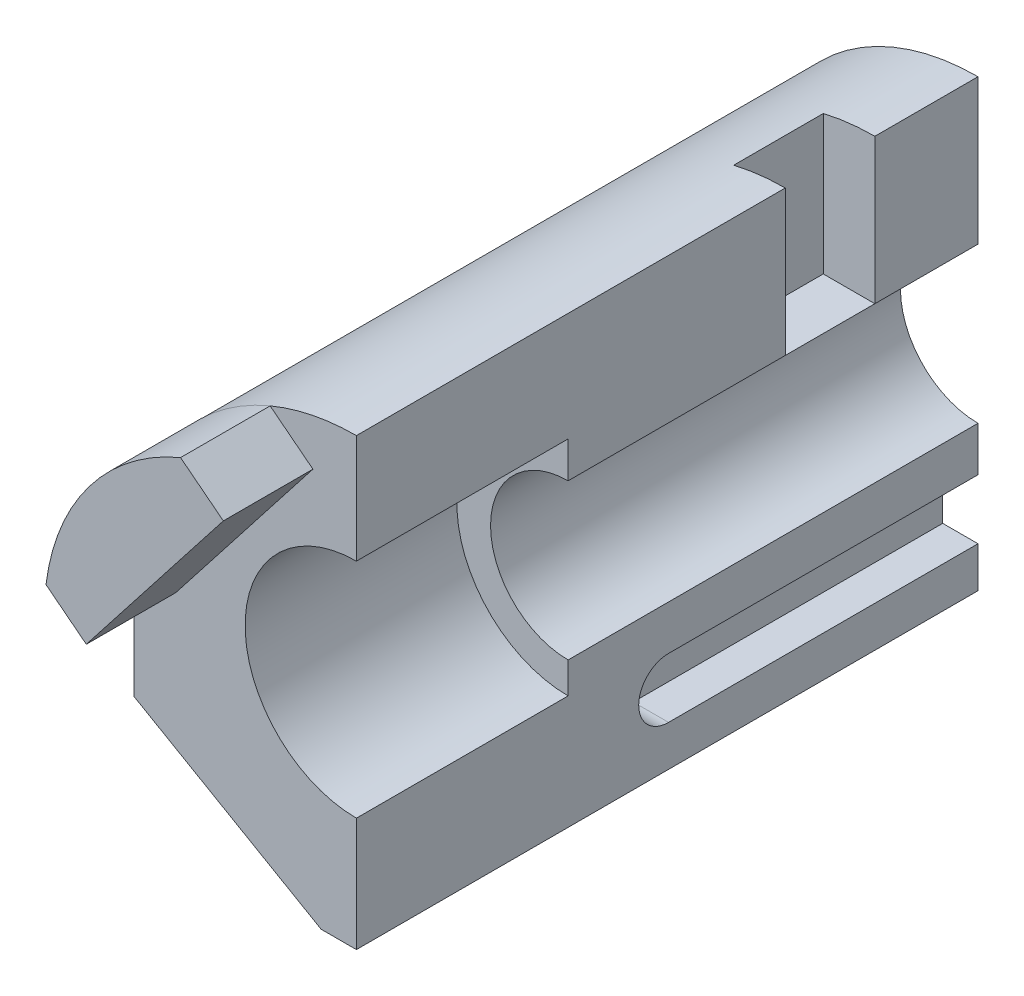
ISO-10303-21;
HEADER;
FILE_DESCRIPTION(('STEP AP214'),'2;1');
FILE_NAME('part.step','',(''),(''),'','','');
FILE_SCHEMA(('AUTOMOTIVE_DESIGN { 1 0 10303 214 1 1 1 1 }'));
ENDSEC;
DATA;
#1=APPLICATION_CONTEXT('core data for automotive mechanical design processes');
#2=APPLICATION_PROTOCOL_DEFINITION('international standard','automotive_design',2000,#1);
#3=PRODUCT_CONTEXT('',#1,'mechanical');
#4=PRODUCT('Part','Part','',(#3));
#5=PRODUCT_RELATED_PRODUCT_CATEGORY('part','',(#4));
#6=PRODUCT_DEFINITION_FORMATION('','',#4);
#7=PRODUCT_DEFINITION_CONTEXT('part definition',#1,'design');
#8=PRODUCT_DEFINITION('design','',#6,#7);
#9=PRODUCT_DEFINITION_SHAPE('','',#8);
#10=(LENGTH_UNIT() NAMED_UNIT(*) SI_UNIT(.MILLI.,.METRE.));
#11=(NAMED_UNIT(*) PLANE_ANGLE_UNIT() SI_UNIT($,.RADIAN.));
#12=(NAMED_UNIT(*) SI_UNIT($,.STERADIAN.) SOLID_ANGLE_UNIT());
#13=UNCERTAINTY_MEASURE_WITH_UNIT(LENGTH_MEASURE(1.E-05),#10,'distance_accuracy_value','');
#14=(GEOMETRIC_REPRESENTATION_CONTEXT(3) GLOBAL_UNCERTAINTY_ASSIGNED_CONTEXT((#13)) GLOBAL_UNIT_ASSIGNED_CONTEXT((#10,
#11,#12)) REPRESENTATION_CONTEXT('',''));
#15=CARTESIAN_POINT('',(0.,0.,0.));
#16=DIRECTION('',(0.,0.,1.));
#17=DIRECTION('',(1.,0.,0.));
#18=AXIS2_PLACEMENT_3D('',#15,#16,#17);
#19=CARTESIAN_POINT('',(82.,70.7378314259157,229.));
#20=DIRECTION('',(-1.,0.,0.));
#21=DIRECTION('',(0.,0.,1.));
#22=AXIS2_PLACEMENT_3D('',#19,#20,#21);
#23=PLANE('',#22);
#24=DIRECTION('',(0.,0.,-1.));
#25=VECTOR('',#24,1.);
#26=CARTESIAN_POINT('',(82.,70.7378314259157,229.));
#27=LINE('',#26,#25);
#28=CARTESIAN_POINT('',(82.,70.7378314259157,151.));
#29=VERTEX_POINT('',#28);
#30=CARTESIAN_POINT('',(82.,70.7378314259157,71.));
#31=VERTEX_POINT('',#30);
#32=EDGE_CURVE('E317',#29,#31,#27,.T.);
#33=ORIENTED_EDGE('',*,*,#32,.T.);
#34=DIRECTION('',(0.,-1.,0.));
#35=VECTOR('',#34,1.);
#36=CARTESIAN_POINT('',(82.,124.162831425916,71.));
#37=LINE('',#36,#35);
#38=CARTESIAN_POINT('',(82.,124.162831425916,71.));
#39=VERTEX_POINT('',#38);
#40=EDGE_CURVE('E60',#39,#31,#37,.T.);
#41=ORIENTED_EDGE('',*,*,#40,.F.);
#42=DIRECTION('',(0.,0.,-1.));
#43=VECTOR('',#42,1.);
#44=CARTESIAN_POINT('',(82.,124.162831425916,229.));
#45=LINE('',#44,#43);
#46=CARTESIAN_POINT('',(82.,124.162831425916,229.));
#47=VERTEX_POINT('',#46);
#48=EDGE_CURVE('E313',#47,#39,#45,.T.);
#49=ORIENTED_EDGE('',*,*,#48,.F.);
#50=DIRECTION('',(0.,1.,0.));
#51=VECTOR('',#50,1.);
#52=CARTESIAN_POINT('',(82.,70.7378314259157,229.));
#53=LINE('',#52,#51);
#54=CARTESIAN_POINT('',(82.,84.1083521317309,229.));
#55=VERTEX_POINT('',#54);
#56=EDGE_CURVE('E293',#55,#47,#53,.T.);
#57=ORIENTED_EDGE('',*,*,#56,.F.);
#58=DIRECTION('',(0.,0.,1.));
#59=VECTOR('',#58,1.);
#60=CARTESIAN_POINT('',(82.,84.1083521317309,151.));
#61=LINE('',#60,#59);
#62=CARTESIAN_POINT('',(82.,84.1083521317309,151.));
#63=VERTEX_POINT('',#62);
#64=EDGE_CURVE('E239',#63,#55,#61,.T.);
#65=ORIENTED_EDGE('',*,*,#64,.F.);
#66=DIRECTION('',(0.,1.,0.));
#67=VECTOR('',#66,1.);
#68=CARTESIAN_POINT('',(82.,70.7378314259157,151.));
#69=LINE('',#68,#67);
#70=EDGE_CURVE('E335',#29,#63,#69,.T.);
#71=ORIENTED_EDGE('',*,*,#70,.F.);
#72=EDGE_LOOP('',(#33,#41,#49,#57,#65,#71));
#73=FACE_BOUND('',#72,.T.);
#74=ADVANCED_FACE('F37',(#73),#23,.F.);
#75=CARTESIAN_POINT('',(82.,42.1628314259157,229.));
#76=DIRECTION('',(0.,0.,-1.));
#77=DIRECTION('',(-1.,0.,0.));
#78=AXIS2_PLACEMENT_3D('',#75,#76,#77);
#79=CYLINDRICAL_SURFACE('',#78,28.575);
#80=CARTESIAN_POINT('',(82.,42.1628314259157,151.));
#81=DIRECTION('',(0.,0.,1.));
#82=DIRECTION('',(1.,0.,0.));
#83=AXIS2_PLACEMENT_3D('',#80,#81,#82);
#84=CIRCLE('',#83,28.575);
#85=CARTESIAN_POINT('',(82.,13.5878314259157,151.));
#86=VERTEX_POINT('',#85);
#87=EDGE_CURVE('E241',#86,#29,#84,.F.);
#88=ORIENTED_EDGE('',*,*,#87,.F.);
#89=DIRECTION('',(0.,0.,-1.));
#90=VECTOR('',#89,1.);
#91=CARTESIAN_POINT('',(82.,13.5878314259157,229.));
#92=LINE('',#91,#90);
#93=CARTESIAN_POINT('',(82.,13.5878314259157,0.));
#94=VERTEX_POINT('',#93);
#95=EDGE_CURVE('E320',#86,#94,#92,.T.);
#96=ORIENTED_EDGE('',*,*,#95,.T.);
#97=CARTESIAN_POINT('',(82.,42.1628314259157,0.));
#98=DIRECTION('',(0.,0.,-1.));
#99=DIRECTION('',(-1.,0.,0.));
#100=AXIS2_PLACEMENT_3D('',#97,#98,#99);
#101=CIRCLE('',#100,28.575);
#102=CARTESIAN_POINT('',(82.,70.7378314259157,0.));
#103=VERTEX_POINT('',#102);
#104=EDGE_CURVE('E307',#94,#103,#101,.T.);
#105=ORIENTED_EDGE('',*,*,#104,.T.);
#106=CARTESIAN_POINT('',(82.,70.7378314259157,38.));
#107=VERTEX_POINT('',#106);
#108=EDGE_CURVE('E316',#107,#103,#27,.T.);
#109=ORIENTED_EDGE('',*,*,#108,.F.);
#110=DIRECTION('',(0.,0.,-1.));
#111=VECTOR('',#110,1.);
#112=CARTESIAN_POINT('',(82.,70.7378314259157,71.));
#113=LINE('',#112,#111);
#114=EDGE_CURVE('E217',#31,#107,#113,.T.);
#115=ORIENTED_EDGE('',*,*,#114,.F.);
#116=ORIENTED_EDGE('',*,*,#32,.F.);
#117=EDGE_LOOP('',(#88,#96,#105,#109,#115,#116));
#118=FACE_BOUND('',#117,.T.);
#119=ADVANCED_FACE('F354',(#118),#79,.F.);
#120=CARTESIAN_POINT('',(82.,42.1628314259157,229.));
#121=DIRECTION('',(0.,0.,-1.));
#122=DIRECTION('',(-1.,0.,0.));
#123=AXIS2_PLACEMENT_3D('',#120,#121,#122);
#124=PLANE('',#123);
#125=DIRECTION('',(0.,1.,0.));
#126=VECTOR('',#125,1.);
#127=CARTESIAN_POINT('',(82.,-39.8371685740843,229.));
#128=LINE('',#127,#126);
#129=CARTESIAN_POINT('',(82.,-39.8371685740843,229.));
#130=VERTEX_POINT('',#129);
#131=CARTESIAN_POINT('',(82.,2.10835213173093,229.));
#132=VERTEX_POINT('',#131);
#133=EDGE_CURVE('E290',#130,#132,#128,.T.);
#134=ORIENTED_EDGE('',*,*,#133,.T.);
#135=CARTESIAN_POINT('',(82.,43.1083521317309,229.));
#136=DIRECTION('',(0.,0.,1.));
#137=DIRECTION('',(1.,0.,0.));
#138=AXIS2_PLACEMENT_3D('',#135,#136,#137);
#139=CIRCLE('',#138,41.);
#140=EDGE_CURVE('E231',#55,#132,#139,.T.);
#141=ORIENTED_EDGE('',*,*,#140,.F.);
#142=ORIENTED_EDGE('',*,*,#56,.T.);
#143=CARTESIAN_POINT('',(82.,42.1628314259157,229.));
#144=DIRECTION('',(0.,0.,1.));
#145=DIRECTION('',(-1.,0.,0.));
#146=AXIS2_PLACEMENT_3D('',#143,#144,#145);
#147=CIRCLE('',#146,82.);
#148=CARTESIAN_POINT('',(50.2189781569696,117.753615590474,229.));
#149=VERTEX_POINT('',#148);
#150=EDGE_CURVE('E279',#47,#149,#147,.T.);
#151=ORIENTED_EDGE('',*,*,#150,.T.);
#152=DIRECTION('',(-0.788010753606726,0.615661475325653,0.));
#153=VECTOR('',#152,1.);
#154=CARTESIAN_POINT('',(50.2189781569696,117.753615590474,229.));
#155=LINE('',#154,#153);
#156=CARTESIAN_POINT('',(65.9791932291041,105.440386083961,229.));
#157=VERTEX_POINT('',#156);
#158=EDGE_CURVE('E250',#157,#149,#155,.T.);
#159=ORIENTED_EDGE('',*,*,#158,.F.);
#160=DIRECTION('',(0.615661475325653,0.788010753606726,0.));
#161=VECTOR('',#160,1.);
#162=CARTESIAN_POINT('',(65.9791932291041,105.440386083961,229.));
#163=LINE('',#162,#161);
#164=CARTESIAN_POINT('',(15.4949522524006,40.8235042882093,229.));
#165=VERTEX_POINT('',#164);
#166=EDGE_CURVE('E262',#165,#157,#163,.T.);
#167=ORIENTED_EDGE('',*,*,#166,.F.);
#168=DIRECTION('',(0.788010753606726,-0.615661475325653,0.));
#169=VECTOR('',#168,1.);
#170=CARTESIAN_POINT('',(15.4949522524006,40.8235042882093,229.));
#171=LINE('',#170,#169);
#172=CARTESIAN_POINT('',(0.644773941236465,52.4257351537835,229.));
#173=VERTEX_POINT('',#172);
#174=EDGE_CURVE('E259',#173,#165,#171,.T.);
#175=ORIENTED_EDGE('',*,*,#174,.F.);
#176=CARTESIAN_POINT('',(0.,42.1628314259157,229.));
#177=VERTEX_POINT('',#176);
#178=EDGE_CURVE('E284',#173,#177,#147,.T.);
#179=ORIENTED_EDGE('',*,*,#178,.T.);
#180=DIRECTION('',(0.,-1.,0.));
#181=VECTOR('',#180,1.);
#182=CARTESIAN_POINT('',(0.,42.1628314259157,229.));
#183=LINE('',#182,#181);
#184=CARTESIAN_POINT('',(0.,0.,229.));
#185=VERTEX_POINT('',#184);
#186=EDGE_CURVE('E282',#177,#185,#183,.T.);
#187=ORIENTED_EDGE('',*,*,#186,.T.);
#188=DIRECTION('',(0.866025403784438,-0.500000000000001,0.));
#189=VECTOR('',#188,1.);
#190=CARTESIAN_POINT('',(0.,0.,229.));
#191=LINE('',#190,#189);
#192=CARTESIAN_POINT('',(69.,-39.8371685740843,229.));
#193=VERTEX_POINT('',#192);
#194=EDGE_CURVE('E286',#185,#193,#191,.T.);
#195=ORIENTED_EDGE('',*,*,#194,.T.);
#196=DIRECTION('',(1.,0.,0.));
#197=VECTOR('',#196,1.);
#198=CARTESIAN_POINT('',(69.,-39.8371685740843,229.));
#199=LINE('',#198,#197);
#200=EDGE_CURVE('E288',#193,#130,#199,.T.);
#201=ORIENTED_EDGE('',*,*,#200,.T.);
#202=EDGE_LOOP('',(#134,#141,#142,#151,#159,#167,#175,#179,#187,#195,#201));
#203=FACE_BOUND('',#202,.T.);
#204=ADVANCED_FACE('F392',(#203),#124,.F.);
#205=CARTESIAN_POINT('',(82.,42.1628314259157,229.));
#206=DIRECTION('',(0.,0.,-1.));
#207=DIRECTION('',(-1.,0.,0.));
#208=AXIS2_PLACEMENT_3D('',#205,#206,#207);
#209=CYLINDRICAL_SURFACE('',#208,82.);
#210=ORIENTED_EDGE('',*,*,#48,.T.);
#211=CARTESIAN_POINT('',(82.,42.1628314259157,71.));
#212=DIRECTION('',(0.,0.,1.));
#213=DIRECTION('',(0.,-1.,0.));
#214=AXIS2_PLACEMENT_3D('',#211,#212,#213);
#215=CIRCLE('',#214,82.);
#216=CARTESIAN_POINT('',(63.,121.931246227766,71.));
#217=VERTEX_POINT('',#216);
#218=EDGE_CURVE('E228',#39,#217,#215,.T.);
#219=ORIENTED_EDGE('',*,*,#218,.T.);
#220=DIRECTION('',(0.,0.,-1.));
#221=VECTOR('',#220,1.);
#222=CARTESIAN_POINT('',(63.,121.931246227766,229.));
#223=LINE('',#222,#221);
#224=CARTESIAN_POINT('',(63.,121.931246227766,38.));
#225=VERTEX_POINT('',#224);
#226=EDGE_CURVE('E45',#225,#217,#223,.F.);
#227=ORIENTED_EDGE('',*,*,#226,.F.);
#228=CARTESIAN_POINT('',(82.,42.1628314259157,38.));
#229=DIRECTION('',(0.,0.,-1.));
#230=DIRECTION('',(0.,1.,0.));
#231=AXIS2_PLACEMENT_3D('',#228,#229,#230);
#232=CIRCLE('',#231,82.);
#233=CARTESIAN_POINT('',(82.,124.162831425916,38.));
#234=VERTEX_POINT('',#233);
#235=EDGE_CURVE('E224',#225,#234,#232,.T.);
#236=ORIENTED_EDGE('',*,*,#235,.T.);
#237=CARTESIAN_POINT('',(82.,124.162831425916,0.));
#238=VERTEX_POINT('',#237);
#239=EDGE_CURVE('E295',#234,#238,#45,.T.);
#240=ORIENTED_EDGE('',*,*,#239,.T.);
#241=CARTESIAN_POINT('',(82.,42.1628314259157,0.));
#242=DIRECTION('',(0.,0.,1.));
#243=DIRECTION('',(-1.,0.,0.));
#244=AXIS2_PLACEMENT_3D('',#241,#242,#243);
#245=CIRCLE('',#244,82.);
#246=CARTESIAN_POINT('',(0.,42.1628314259157,0.));
#247=VERTEX_POINT('',#246);
#248=EDGE_CURVE('E278',#238,#247,#245,.T.);
#249=ORIENTED_EDGE('',*,*,#248,.T.);
#250=DIRECTION('',(0.,0.,-1.));
#251=VECTOR('',#250,1.);
#252=CARTESIAN_POINT('',(0.,42.1628314259157,229.));
#253=LINE('',#252,#251);
#254=EDGE_CURVE('E332',#177,#247,#253,.T.);
#255=ORIENTED_EDGE('',*,*,#254,.F.);
#256=ORIENTED_EDGE('',*,*,#178,.F.);
#257=EDGE_CURVE('E283',#149,#173,#147,.T.);
#258=ORIENTED_EDGE('',*,*,#257,.F.);
#259=ORIENTED_EDGE('',*,*,#150,.F.);
#260=EDGE_LOOP('',(#210,#219,#227,#236,#240,#249,#255,#256,#258,#259));
#261=FACE_BOUND('',#260,.T.);
#262=ADVANCED_FACE('F39',(#261),#209,.T.);
#263=CARTESIAN_POINT('',(0.,42.1628314259157,229.));
#264=DIRECTION('',(1.,0.,0.));
#265=DIRECTION('',(0.,0.,-1.));
#266=AXIS2_PLACEMENT_3D('',#263,#264,#265);
#267=PLANE('',#266);
#268=DIRECTION('',(0.,-1.,0.));
#269=VECTOR('',#268,1.);
#270=CARTESIAN_POINT('',(0.,42.1628314259157,0.));
#271=LINE('',#270,#269);
#272=CARTESIAN_POINT('',(0.,0.,0.));
#273=VERTEX_POINT('',#272);
#274=EDGE_CURVE('E298',#247,#273,#271,.T.);
#275=ORIENTED_EDGE('',*,*,#274,.T.);
#276=DIRECTION('',(0.,0.,-1.));
#277=VECTOR('',#276,1.);
#278=CARTESIAN_POINT('',(0.,0.,229.));
#279=LINE('',#278,#277);
#280=EDGE_CURVE('E329',#185,#273,#279,.T.);
#281=ORIENTED_EDGE('',*,*,#280,.F.);
#282=ORIENTED_EDGE('',*,*,#186,.F.);
#283=ORIENTED_EDGE('',*,*,#254,.T.);
#284=EDGE_LOOP('',(#275,#281,#282,#283));
#285=FACE_BOUND('',#284,.T.);
#286=ADVANCED_FACE('F373',(#285),#267,.F.);
#287=CARTESIAN_POINT('',(0.,0.,229.));
#288=DIRECTION('',(0.500000000000001,0.866025403784438,0.));
#289=DIRECTION('',(-0.866025403784438,0.500000000000001,0.));
#290=AXIS2_PLACEMENT_3D('',#287,#288,#289);
#291=PLANE('',#290);
#292=DIRECTION('',(0.866025403784438,-0.500000000000001,0.));
#293=VECTOR('',#292,1.);
#294=CARTESIAN_POINT('',(0.,0.,0.));
#295=LINE('',#294,#293);
#296=CARTESIAN_POINT('',(69.,-39.8371685740843,0.));
#297=VERTEX_POINT('',#296);
#298=EDGE_CURVE('E300',#273,#297,#295,.T.);
#299=ORIENTED_EDGE('',*,*,#298,.T.);
#300=DIRECTION('',(0.,0.,-1.));
#301=VECTOR('',#300,1.);
#302=CARTESIAN_POINT('',(69.,-39.8371685740843,229.));
#303=LINE('',#302,#301);
#304=EDGE_CURVE('E326',#193,#297,#303,.T.);
#305=ORIENTED_EDGE('',*,*,#304,.F.);
#306=ORIENTED_EDGE('',*,*,#194,.F.);
#307=ORIENTED_EDGE('',*,*,#280,.T.);
#308=EDGE_LOOP('',(#299,#305,#306,#307));
#309=FACE_BOUND('',#308,.T.);
#310=ADVANCED_FACE('F427',(#309),#291,.F.);
#311=CARTESIAN_POINT('',(69.,-39.8371685740843,229.));
#312=DIRECTION('',(0.,1.,0.));
#313=DIRECTION('',(-1.,0.,0.));
#314=AXIS2_PLACEMENT_3D('',#311,#312,#313);
#315=PLANE('',#314);
#316=DIRECTION('',(1.,0.,0.));
#317=VECTOR('',#316,1.);
#318=CARTESIAN_POINT('',(69.,-39.8371685740843,0.));
#319=LINE('',#318,#317);
#320=CARTESIAN_POINT('',(82.,-39.8371685740843,0.));
#321=VERTEX_POINT('',#320);
#322=EDGE_CURVE('E302',#297,#321,#319,.T.);
#323=ORIENTED_EDGE('',*,*,#322,.T.);
#324=DIRECTION('',(0.,0.,-1.));
#325=VECTOR('',#324,1.);
#326=CARTESIAN_POINT('',(82.,-39.8371685740843,229.));
#327=LINE('',#326,#325);
#328=EDGE_CURVE('E323',#130,#321,#327,.T.);
#329=ORIENTED_EDGE('',*,*,#328,.F.);
#330=ORIENTED_EDGE('',*,*,#200,.F.);
#331=ORIENTED_EDGE('',*,*,#304,.T.);
#332=EDGE_LOOP('',(#323,#329,#330,#331));
#333=FACE_BOUND('',#332,.T.);
#334=ADVANCED_FACE('F421',(#333),#315,.F.);
#335=CARTESIAN_POINT('',(82.,-39.8371685740843,229.));
#336=DIRECTION('',(-1.,0.,0.));
#337=DIRECTION('',(0.,-1.,0.));
#338=AXIS2_PLACEMENT_3D('',#335,#336,#337);
#339=PLANE('',#338);
#340=DIRECTION('',(0.,1.,0.));
#341=VECTOR('',#340,1.);
#342=CARTESIAN_POINT('',(82.,-39.8371685740843,0.));
#343=LINE('',#342,#341);
#344=CARTESIAN_POINT('',(82.,-24.8371685740843,0.));
#345=VERTEX_POINT('',#344);
#346=EDGE_CURVE('E304',#321,#345,#343,.T.);
#347=ORIENTED_EDGE('',*,*,#346,.T.);
#348=DIRECTION('',(0.,0.,-1.));
#349=VECTOR('',#348,1.);
#350=CARTESIAN_POINT('',(82.,-24.8371685740843,0.));
#351=LINE('',#350,#349);
#352=CARTESIAN_POINT('',(82.,-24.8371685740843,114.));
#353=VERTEX_POINT('',#352);
#354=EDGE_CURVE('E194',#353,#345,#351,.T.);
#355=ORIENTED_EDGE('',*,*,#354,.F.);
#356=CARTESIAN_POINT('',(82.,-13.8371685740843,114.));
#357=DIRECTION('',(1.,0.,0.));
#358=DIRECTION('',(0.,1.,0.));
#359=AXIS2_PLACEMENT_3D('',#356,#357,#358);
#360=CIRCLE('',#359,11.);
#361=CARTESIAN_POINT('',(82.,-2.83716857408429,114.));
#362=VERTEX_POINT('',#361);
#363=EDGE_CURVE('E619',#362,#353,#360,.T.);
#364=ORIENTED_EDGE('',*,*,#363,.F.);
#365=DIRECTION('',(0.,0.,1.));
#366=VECTOR('',#365,1.);
#367=CARTESIAN_POINT('',(82.,-2.83716857408429,0.));
#368=LINE('',#367,#366);
#369=CARTESIAN_POINT('',(82.,-2.83716857408429,0.));
#370=VERTEX_POINT('',#369);
#371=EDGE_CURVE('E621',#370,#362,#368,.T.);
#372=ORIENTED_EDGE('',*,*,#371,.F.);
#373=EDGE_CURVE('E199',#370,#94,#343,.T.);
#374=ORIENTED_EDGE('',*,*,#373,.T.);
#375=ORIENTED_EDGE('',*,*,#95,.F.);
#376=DIRECTION('',(0.,1.,0.));
#377=VECTOR('',#376,1.);
#378=CARTESIAN_POINT('',(82.,84.1083521317309,151.));
#379=LINE('',#378,#377);
#380=CARTESIAN_POINT('',(82.,2.10835213173093,151.));
#381=VERTEX_POINT('',#380);
#382=EDGE_CURVE('E235',#381,#86,#379,.T.);
#383=ORIENTED_EDGE('',*,*,#382,.F.);
#384=DIRECTION('',(0.,0.,1.));
#385=VECTOR('',#384,1.);
#386=CARTESIAN_POINT('',(82.,2.10835213173093,151.));
#387=LINE('',#386,#385);
#388=EDGE_CURVE('E237',#381,#132,#387,.T.);
#389=ORIENTED_EDGE('',*,*,#388,.T.);
#390=ORIENTED_EDGE('',*,*,#133,.F.);
#391=ORIENTED_EDGE('',*,*,#328,.T.);
#392=EDGE_LOOP('',(#347,#355,#364,#372,#374,#375,#383,#389,#390,#391));
#393=FACE_BOUND('',#392,.T.);
#394=ADVANCED_FACE('F416',(#393),#339,.F.);
#395=ORIENTED_EDGE('',*,*,#239,.F.);
#396=DIRECTION('',(0.,1.,0.));
#397=VECTOR('',#396,1.);
#398=CARTESIAN_POINT('',(82.,124.162831425916,38.));
#399=LINE('',#398,#397);
#400=EDGE_CURVE('E209',#107,#234,#399,.T.);
#401=ORIENTED_EDGE('',*,*,#400,.F.);
#402=ORIENTED_EDGE('',*,*,#108,.T.);
#403=DIRECTION('',(0.,1.,0.));
#404=VECTOR('',#403,1.);
#405=CARTESIAN_POINT('',(82.,70.7378314259157,0.));
#406=LINE('',#405,#404);
#407=EDGE_CURVE('E310',#103,#238,#406,.T.);
#408=ORIENTED_EDGE('',*,*,#407,.T.);
#409=EDGE_LOOP('',(#395,#401,#402,#408));
#410=FACE_BOUND('',#409,.T.);
#411=ADVANCED_FACE('F362',(#410),#23,.F.);
#412=CARTESIAN_POINT('',(82.,42.1628314259157,0.));
#413=DIRECTION('',(0.,0.,-1.));
#414=DIRECTION('',(-1.,0.,0.));
#415=AXIS2_PLACEMENT_3D('',#412,#413,#414);
#416=PLANE('',#415);
#417=DIRECTION('',(1.,0.,0.));
#418=VECTOR('',#417,1.);
#419=CARTESIAN_POINT('',(69.,-24.8371685740843,0.));
#420=LINE('',#419,#418);
#421=CARTESIAN_POINT('',(69.,-24.8371685740843,0.));
#422=VERTEX_POINT('',#421);
#423=EDGE_CURVE('E218',#422,#345,#420,.T.);
#424=ORIENTED_EDGE('',*,*,#423,.T.);
#425=ORIENTED_EDGE('',*,*,#346,.F.);
#426=ORIENTED_EDGE('',*,*,#322,.F.);
#427=ORIENTED_EDGE('',*,*,#298,.F.);
#428=ORIENTED_EDGE('',*,*,#274,.F.);
#429=ORIENTED_EDGE('',*,*,#248,.F.);
#430=ORIENTED_EDGE('',*,*,#407,.F.);
#431=ORIENTED_EDGE('',*,*,#104,.F.);
#432=ORIENTED_EDGE('',*,*,#373,.F.);
#433=DIRECTION('',(1.,0.,0.));
#434=VECTOR('',#433,1.);
#435=CARTESIAN_POINT('',(69.,-2.83716857408429,0.));
#436=LINE('',#435,#434);
#437=CARTESIAN_POINT('',(69.,-2.83716857408429,0.));
#438=VERTEX_POINT('',#437);
#439=EDGE_CURVE('E189',#438,#370,#436,.T.);
#440=ORIENTED_EDGE('',*,*,#439,.F.);
#441=DIRECTION('',(0.,-1.,0.));
#442=VECTOR('',#441,1.);
#443=CARTESIAN_POINT('',(69.,42.1628314259157,0.));
#444=LINE('',#443,#442);
#445=EDGE_CURVE('E11',#438,#422,#444,.T.);
#446=ORIENTED_EDGE('',*,*,#445,.T.);
#447=EDGE_LOOP('',(#424,#425,#426,#427,#428,#429,#430,#431,#432,#440,#446));
#448=FACE_BOUND('',#447,.T.);
#449=ADVANCED_FACE('F197',(#448),#416,.T.);
#450=CARTESIAN_POINT('',(81.5362352474949,42.5147603174558,262.));
#451=DIRECTION('',(0.,0.,-1.));
#452=DIRECTION('',(-1.,0.,0.));
#453=AXIS2_PLACEMENT_3D('',#450,#451,#452);
#454=CYLINDRICAL_SURFACE('',#453,81.4963553446915);
#455=CARTESIAN_POINT('',(81.5362352474949,42.5147603174558,229.));
#456=DIRECTION('',(0.,0.,1.));
#457=DIRECTION('',(-1.,0.,0.));
#458=AXIS2_PLACEMENT_3D('',#455,#456,#457);
#459=CIRCLE('',#458,81.4963553446915);
#460=EDGE_CURVE('E245',#149,#173,#459,.T.);
#461=ORIENTED_EDGE('',*,*,#460,.T.);
#462=DIRECTION('',(0.,0.,-1.));
#463=VECTOR('',#462,1.);
#464=CARTESIAN_POINT('',(0.644773941236454,52.4257351537835,262.));
#465=LINE('',#464,#463);
#466=CARTESIAN_POINT('',(0.644773941236454,52.4257351537835,262.));
#467=VERTEX_POINT('',#466);
#468=EDGE_CURVE('E275',#467,#173,#465,.T.);
#469=ORIENTED_EDGE('',*,*,#468,.F.);
#470=CARTESIAN_POINT('',(81.5362352474949,42.5147603174558,262.));
#471=DIRECTION('',(0.,0.,1.));
#472=DIRECTION('',(-1.,0.,0.));
#473=AXIS2_PLACEMENT_3D('',#470,#471,#472);
#474=CIRCLE('',#473,81.4963553446915);
#475=CARTESIAN_POINT('',(50.2189781569696,117.753615590474,262.));
#476=VERTEX_POINT('',#475);
#477=EDGE_CURVE('E246',#476,#467,#474,.T.);
#478=ORIENTED_EDGE('',*,*,#477,.F.);
#479=DIRECTION('',(0.,0.,-1.));
#480=VECTOR('',#479,1.);
#481=CARTESIAN_POINT('',(50.2189781569696,117.753615590474,262.));
#482=LINE('',#481,#480);
#483=EDGE_CURVE('E256',#476,#149,#482,.T.);
#484=ORIENTED_EDGE('',*,*,#483,.T.);
#485=EDGE_LOOP('',(#461,#469,#478,#484));
#486=FACE_BOUND('',#485,.T.);
#487=ADVANCED_FACE('F386',(#486),#454,.T.);
#488=CARTESIAN_POINT('',(15.4949522524006,40.8235042882093,262.));
#489=DIRECTION('',(0.615661475325653,0.788010753606726,0.));
#490=DIRECTION('',(-0.788010753606726,0.615661475325653,0.));
#491=AXIS2_PLACEMENT_3D('',#488,#489,#490);
#492=PLANE('',#491);
#493=ORIENTED_EDGE('',*,*,#174,.T.);
#494=DIRECTION('',(0.,0.,-1.));
#495=VECTOR('',#494,1.);
#496=CARTESIAN_POINT('',(15.4949522524006,40.8235042882093,262.));
#497=LINE('',#496,#495);
#498=CARTESIAN_POINT('',(15.4949522524006,40.8235042882093,262.));
#499=VERTEX_POINT('',#498);
#500=EDGE_CURVE('E272',#499,#165,#497,.T.);
#501=ORIENTED_EDGE('',*,*,#500,.F.);
#502=DIRECTION('',(0.788010753606726,-0.615661475325653,0.));
#503=VECTOR('',#502,1.);
#504=CARTESIAN_POINT('',(15.4949522524006,40.8235042882093,262.));
#505=LINE('',#504,#503);
#506=EDGE_CURVE('E249',#467,#499,#505,.T.);
#507=ORIENTED_EDGE('',*,*,#506,.F.);
#508=ORIENTED_EDGE('',*,*,#468,.T.);
#509=EDGE_LOOP('',(#493,#501,#507,#508));
#510=FACE_BOUND('',#509,.T.);
#511=ADVANCED_FACE('F382',(#510),#492,.F.);
#512=CARTESIAN_POINT('',(65.9791932291041,105.440386083961,262.));
#513=DIRECTION('',(-0.788010753606726,0.615661475325653,0.));
#514=DIRECTION('',(-0.615661475325653,-0.788010753606726,0.));
#515=AXIS2_PLACEMENT_3D('',#512,#513,#514);
#516=PLANE('',#515);
#517=ORIENTED_EDGE('',*,*,#166,.T.);
#518=DIRECTION('',(0.,0.,-1.));
#519=VECTOR('',#518,1.);
#520=CARTESIAN_POINT('',(65.9791932291041,105.440386083961,262.));
#521=LINE('',#520,#519);
#522=CARTESIAN_POINT('',(65.9791932291041,105.440386083961,262.));
#523=VERTEX_POINT('',#522);
#524=EDGE_CURVE('E269',#523,#157,#521,.T.);
#525=ORIENTED_EDGE('',*,*,#524,.F.);
#526=DIRECTION('',(0.615661475325653,0.788010753606726,0.));
#527=VECTOR('',#526,1.);
#528=CARTESIAN_POINT('',(65.9791932291041,105.440386083961,262.));
#529=LINE('',#528,#527);
#530=EDGE_CURVE('E252',#499,#523,#529,.T.);
#531=ORIENTED_EDGE('',*,*,#530,.F.);
#532=ORIENTED_EDGE('',*,*,#500,.T.);
#533=EDGE_LOOP('',(#517,#525,#531,#532));
#534=FACE_BOUND('',#533,.T.);
#535=ADVANCED_FACE('F394',(#534),#516,.F.);
#536=CARTESIAN_POINT('',(50.2189781569696,117.753615590474,262.));
#537=DIRECTION('',(-0.615661475325653,-0.788010753606726,0.));
#538=DIRECTION('',(0.788010753606726,-0.615661475325653,0.));
#539=AXIS2_PLACEMENT_3D('',#536,#537,#538);
#540=PLANE('',#539);
#541=ORIENTED_EDGE('',*,*,#158,.T.);
#542=ORIENTED_EDGE('',*,*,#483,.F.);
#543=DIRECTION('',(-0.788010753606726,0.615661475325653,0.));
#544=VECTOR('',#543,1.);
#545=CARTESIAN_POINT('',(50.2189781569696,117.753615590474,262.));
#546=LINE('',#545,#544);
#547=EDGE_CURVE('E254',#523,#476,#546,.T.);
#548=ORIENTED_EDGE('',*,*,#547,.F.);
#549=ORIENTED_EDGE('',*,*,#524,.T.);
#550=EDGE_LOOP('',(#541,#542,#548,#549));
#551=FACE_BOUND('',#550,.T.);
#552=ADVANCED_FACE('F390',(#551),#540,.F.);
#553=CARTESIAN_POINT('',(81.5362352474949,42.5147603174558,262.));
#554=DIRECTION('',(0.,0.,-1.));
#555=DIRECTION('',(-1.,0.,0.));
#556=AXIS2_PLACEMENT_3D('',#553,#554,#555);
#557=PLANE('',#556);
#558=ORIENTED_EDGE('',*,*,#477,.T.);
#559=ORIENTED_EDGE('',*,*,#506,.T.);
#560=ORIENTED_EDGE('',*,*,#530,.T.);
#561=ORIENTED_EDGE('',*,*,#547,.T.);
#562=EDGE_LOOP('',(#558,#559,#560,#561));
#563=FACE_BOUND('',#562,.T.);
#564=ADVANCED_FACE('F397',(#563),#557,.F.);
#565=CARTESIAN_POINT('',(81.5362352474949,42.5147603174558,229.));
#566=DIRECTION('',(0.,0.,-1.));
#567=DIRECTION('',(-1.,0.,0.));
#568=AXIS2_PLACEMENT_3D('',#565,#566,#567);
#569=PLANE('',#568);
#570=ORIENTED_EDGE('',*,*,#460,.F.);
#571=ORIENTED_EDGE('',*,*,#257,.T.);
#572=EDGE_LOOP('',(#570,#571));
#573=FACE_BOUND('',#572,.T.);
#574=ADVANCED_FACE('F379',(#573),#569,.T.);
#575=CARTESIAN_POINT('',(82.,43.1083521317309,151.));
#576=DIRECTION('',(0.,0.,1.));
#577=DIRECTION('',(1.,0.,0.));
#578=AXIS2_PLACEMENT_3D('',#575,#576,#577);
#579=PLANE('',#578);
#580=ORIENTED_EDGE('',*,*,#87,.T.);
#581=ORIENTED_EDGE('',*,*,#70,.T.);
#582=CARTESIAN_POINT('',(82.,43.1083521317309,151.));
#583=DIRECTION('',(0.,0.,1.));
#584=DIRECTION('',(1.,0.,0.));
#585=AXIS2_PLACEMENT_3D('',#582,#583,#584);
#586=CIRCLE('',#585,41.);
#587=EDGE_CURVE('E232',#63,#381,#586,.T.);
#588=ORIENTED_EDGE('',*,*,#587,.T.);
#589=ORIENTED_EDGE('',*,*,#382,.T.);
#590=EDGE_LOOP('',(#580,#581,#588,#589));
#591=FACE_BOUND('',#590,.T.);
#592=ADVANCED_FACE('F404',(#591),#579,.T.);
#593=CARTESIAN_POINT('',(82.,43.1083521317309,151.));
#594=DIRECTION('',(0.,0.,1.));
#595=DIRECTION('',(1.,0.,0.));
#596=AXIS2_PLACEMENT_3D('',#593,#594,#595);
#597=CYLINDRICAL_SURFACE('',#596,41.);
#598=ORIENTED_EDGE('',*,*,#140,.T.);
#599=ORIENTED_EDGE('',*,*,#388,.F.);
#600=ORIENTED_EDGE('',*,*,#587,.F.);
#601=ORIENTED_EDGE('',*,*,#64,.T.);
#602=EDGE_LOOP('',(#598,#599,#600,#601));
#603=FACE_BOUND('',#602,.T.);
#604=ADVANCED_FACE('F486',(#603),#597,.F.);
#605=CARTESIAN_POINT('',(63.,0.,0.));
#606=DIRECTION('',(1.,0.,0.));
#607=DIRECTION('',(0.,0.,-1.));
#608=AXIS2_PLACEMENT_3D('',#605,#606,#607);
#609=PLANE('',#608);
#610=ORIENTED_EDGE('',*,*,#226,.T.);
#611=DIRECTION('',(0.,-1.,0.));
#612=VECTOR('',#611,1.);
#613=CARTESIAN_POINT('',(63.,124.162831425916,71.));
#614=LINE('',#613,#612);
#615=CARTESIAN_POINT('',(63.,70.7378314259157,71.));
#616=VERTEX_POINT('',#615);
#617=EDGE_CURVE('E206',#217,#616,#614,.T.);
#618=ORIENTED_EDGE('',*,*,#617,.T.);
#619=DIRECTION('',(0.,0.,-1.));
#620=VECTOR('',#619,1.);
#621=CARTESIAN_POINT('',(63.,70.7378314259157,71.));
#622=LINE('',#621,#620);
#623=CARTESIAN_POINT('',(63.,70.7378314259157,38.));
#624=VERTEX_POINT('',#623);
#625=EDGE_CURVE('E208',#616,#624,#622,.T.);
#626=ORIENTED_EDGE('',*,*,#625,.T.);
#627=DIRECTION('',(0.,1.,0.));
#628=VECTOR('',#627,1.);
#629=CARTESIAN_POINT('',(63.,124.162831425916,38.));
#630=LINE('',#629,#628);
#631=EDGE_CURVE('E212',#624,#225,#630,.T.);
#632=ORIENTED_EDGE('',*,*,#631,.T.);
#633=EDGE_LOOP('',(#610,#618,#626,#632));
#634=FACE_BOUND('',#633,.T.);
#635=ADVANCED_FACE('F339',(#634),#609,.T.);
#636=CARTESIAN_POINT('',(63.,124.162831425916,71.));
#637=DIRECTION('',(0.,0.,1.));
#638=DIRECTION('',(0.,-1.,0.));
#639=AXIS2_PLACEMENT_3D('',#636,#637,#638);
#640=PLANE('',#639);
#641=ORIENTED_EDGE('',*,*,#40,.T.);
#642=DIRECTION('',(1.,0.,0.));
#643=VECTOR('',#642,1.);
#644=CARTESIAN_POINT('',(63.,70.7378314259157,71.));
#645=LINE('',#644,#643);
#646=EDGE_CURVE('E215',#616,#31,#645,.T.);
#647=ORIENTED_EDGE('',*,*,#646,.F.);
#648=ORIENTED_EDGE('',*,*,#617,.F.);
#649=ORIENTED_EDGE('',*,*,#218,.F.);
#650=EDGE_LOOP('',(#641,#647,#648,#649));
#651=FACE_BOUND('',#650,.T.);
#652=ADVANCED_FACE('F342',(#651),#640,.F.);
#653=CARTESIAN_POINT('',(63.,124.162831425916,38.));
#654=DIRECTION('',(0.,0.,-1.));
#655=DIRECTION('',(0.,1.,0.));
#656=AXIS2_PLACEMENT_3D('',#653,#654,#655);
#657=PLANE('',#656);
#658=ORIENTED_EDGE('',*,*,#631,.F.);
#659=DIRECTION('',(1.,0.,0.));
#660=VECTOR('',#659,1.);
#661=CARTESIAN_POINT('',(63.,70.7378314259157,38.));
#662=LINE('',#661,#660);
#663=EDGE_CURVE('E222',#624,#107,#662,.T.);
#664=ORIENTED_EDGE('',*,*,#663,.T.);
#665=ORIENTED_EDGE('',*,*,#400,.T.);
#666=ORIENTED_EDGE('',*,*,#235,.F.);
#667=EDGE_LOOP('',(#658,#664,#665,#666));
#668=FACE_BOUND('',#667,.T.);
#669=ADVANCED_FACE('F364',(#668),#657,.F.);
#670=CARTESIAN_POINT('',(63.,70.7378314259157,71.));
#671=DIRECTION('',(0.,-1.,0.));
#672=DIRECTION('',(0.,0.,-1.));
#673=AXIS2_PLACEMENT_3D('',#670,#671,#672);
#674=PLANE('',#673);
#675=ORIENTED_EDGE('',*,*,#114,.T.);
#676=ORIENTED_EDGE('',*,*,#663,.F.);
#677=ORIENTED_EDGE('',*,*,#625,.F.);
#678=ORIENTED_EDGE('',*,*,#646,.T.);
#679=EDGE_LOOP('',(#675,#676,#677,#678));
#680=FACE_BOUND('',#679,.T.);
#681=ADVANCED_FACE('F359',(#680),#674,.F.);
#682=CARTESIAN_POINT('',(69.,-24.8371685740843,0.));
#683=DIRECTION('',(0.,-1.,0.));
#684=DIRECTION('',(1.,0.,0.));
#685=AXIS2_PLACEMENT_3D('',#682,#683,#684);
#686=PLANE('',#685);
#687=ORIENTED_EDGE('',*,*,#354,.T.);
#688=ORIENTED_EDGE('',*,*,#423,.F.);
#689=DIRECTION('',(0.,0.,-1.));
#690=VECTOR('',#689,1.);
#691=CARTESIAN_POINT('',(69.,-24.8371685740843,0.));
#692=LINE('',#691,#690);
#693=CARTESIAN_POINT('',(69.,-24.8371685740843,114.));
#694=VERTEX_POINT('',#693);
#695=EDGE_CURVE('E52',#694,#422,#692,.T.);
#696=ORIENTED_EDGE('',*,*,#695,.F.);
#697=DIRECTION('',(1.,0.,0.));
#698=VECTOR('',#697,1.);
#699=CARTESIAN_POINT('',(69.,-24.8371685740843,114.));
#700=LINE('',#699,#698);
#701=EDGE_CURVE('E201',#694,#353,#700,.T.);
#702=ORIENTED_EDGE('',*,*,#701,.T.);
#703=EDGE_LOOP('',(#687,#688,#696,#702));
#704=FACE_BOUND('',#703,.T.);
#705=ADVANCED_FACE('F554',(#704),#686,.F.);
#706=CARTESIAN_POINT('',(69.,-13.8371685740843,114.));
#707=DIRECTION('',(1.,0.,0.));
#708=DIRECTION('',(0.,1.,0.));
#709=AXIS2_PLACEMENT_3D('',#706,#707,#708);
#710=CYLINDRICAL_SURFACE('',#709,11.);
#711=ORIENTED_EDGE('',*,*,#363,.T.);
#712=ORIENTED_EDGE('',*,*,#701,.F.);
#713=CARTESIAN_POINT('',(69.,-13.8371685740843,114.));
#714=DIRECTION('',(1.,0.,0.));
#715=DIRECTION('',(0.,1.,0.));
#716=AXIS2_PLACEMENT_3D('',#713,#714,#715);
#717=CIRCLE('',#716,11.);
#718=CARTESIAN_POINT('',(69.,-2.83716857408428,114.));
#719=VERTEX_POINT('',#718);
#720=EDGE_CURVE('E193',#719,#694,#717,.T.);
#721=ORIENTED_EDGE('',*,*,#720,.F.);
#722=DIRECTION('',(1.,0.,0.));
#723=VECTOR('',#722,1.);
#724=CARTESIAN_POINT('',(69.,-2.83716857408428,114.));
#725=LINE('',#724,#723);
#726=EDGE_CURVE('E191',#719,#362,#725,.T.);
#727=ORIENTED_EDGE('',*,*,#726,.T.);
#728=EDGE_LOOP('',(#711,#712,#721,#727));
#729=FACE_BOUND('',#728,.T.);
#730=ADVANCED_FACE('F575',(#729),#710,.F.);
#731=CARTESIAN_POINT('',(69.,-2.83716857408429,0.));
#732=DIRECTION('',(0.,1.,0.));
#733=DIRECTION('',(-1.,0.,0.));
#734=AXIS2_PLACEMENT_3D('',#731,#732,#733);
#735=PLANE('',#734);
#736=ORIENTED_EDGE('',*,*,#371,.T.);
#737=ORIENTED_EDGE('',*,*,#726,.F.);
#738=DIRECTION('',(0.,0.,1.));
#739=VECTOR('',#738,1.);
#740=CARTESIAN_POINT('',(69.,-2.83716857408429,0.));
#741=LINE('',#740,#739);
#742=EDGE_CURVE('E182',#438,#719,#741,.T.);
#743=ORIENTED_EDGE('',*,*,#742,.F.);
#744=ORIENTED_EDGE('',*,*,#439,.T.);
#745=EDGE_LOOP('',(#736,#737,#743,#744));
#746=FACE_BOUND('',#745,.T.);
#747=ADVANCED_FACE('F188',(#746),#735,.F.);
#748=CARTESIAN_POINT('',(69.,-13.8371685740843,0.));
#749=DIRECTION('',(1.,0.,0.));
#750=DIRECTION('',(0.,1.,0.));
#751=AXIS2_PLACEMENT_3D('',#748,#749,#750);
#752=PLANE('',#751);
#753=ORIENTED_EDGE('',*,*,#742,.T.);
#754=ORIENTED_EDGE('',*,*,#720,.T.);
#755=ORIENTED_EDGE('',*,*,#695,.T.);
#756=ORIENTED_EDGE('',*,*,#445,.F.);
#757=EDGE_LOOP('',(#753,#754,#755,#756));
#758=FACE_BOUND('',#757,.T.);
#759=ADVANCED_FACE('F181',(#758),#752,.T.);
#760=CLOSED_SHELL('',(#74,#119,#204,#262,#286,#310,#334,#394,#411,#449,#487,#511,#535,#552,#564,
#574,#592,#604,#635,#652,#669,#681,#705,#730,#747,#759));
#761=MANIFOLD_SOLID_BREP('B2',#760);
#762=ADVANCED_BREP_SHAPE_REPRESENTATION('',(#18,#761),#14);
#763=SHAPE_DEFINITION_REPRESENTATION(#9,#762);
ENDSEC;
END-ISO-10303-21;
